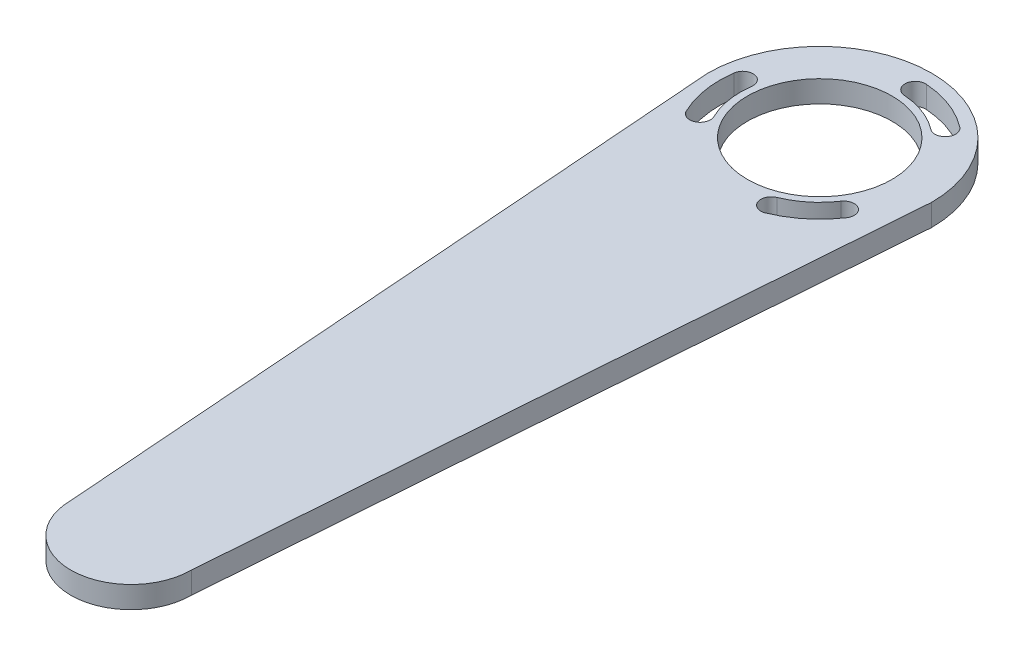
ISO-10303-21;
HEADER;
FILE_DESCRIPTION(('STEP AP214'),'2;1');
FILE_NAME('part.step','',(''),(''),'','','');
FILE_SCHEMA(('AUTOMOTIVE_DESIGN { 1 0 10303 214 1 1 1 1 }'));
ENDSEC;
DATA;
#1=APPLICATION_CONTEXT('core data for automotive mechanical design processes');
#2=APPLICATION_PROTOCOL_DEFINITION('international standard','automotive_design',2000,#1);
#3=PRODUCT_CONTEXT('',#1,'mechanical');
#4=PRODUCT('Part','Part','',(#3));
#5=PRODUCT_RELATED_PRODUCT_CATEGORY('part','',(#4));
#6=PRODUCT_DEFINITION_FORMATION('','',#4);
#7=PRODUCT_DEFINITION_CONTEXT('part definition',#1,'design');
#8=PRODUCT_DEFINITION('design','',#6,#7);
#9=PRODUCT_DEFINITION_SHAPE('','',#8);
#10=(LENGTH_UNIT() NAMED_UNIT(*) SI_UNIT(.MILLI.,.METRE.));
#11=(NAMED_UNIT(*) PLANE_ANGLE_UNIT() SI_UNIT($,.RADIAN.));
#12=(NAMED_UNIT(*) SI_UNIT($,.STERADIAN.) SOLID_ANGLE_UNIT());
#13=UNCERTAINTY_MEASURE_WITH_UNIT(LENGTH_MEASURE(1.E-05),#10,'distance_accuracy_value','');
#14=(GEOMETRIC_REPRESENTATION_CONTEXT(3) GLOBAL_UNCERTAINTY_ASSIGNED_CONTEXT((#13)) GLOBAL_UNIT_ASSIGNED_CONTEXT((#10,
#11,#12)) REPRESENTATION_CONTEXT('',''));
#15=CARTESIAN_POINT('',(0.,0.,0.));
#16=DIRECTION('',(0.,0.,1.));
#17=DIRECTION('',(1.,0.,0.));
#18=AXIS2_PLACEMENT_3D('',#15,#16,#17);
#19=CARTESIAN_POINT('',(0.,3.175,0.));
#20=DIRECTION('',(0.,1.,0.));
#21=DIRECTION('',(0.,0.,1.));
#22=AXIS2_PLACEMENT_3D('',#19,#20,#21);
#23=PLANE('',#22);
#24=CARTESIAN_POINT('',(9.92653417651803,3.175,24.030478964066));
#25=DIRECTION('',(0.,-1.,0.));
#26=DIRECTION('',(-0.866025403784444,0.,-0.499999999999991));
#27=AXIS2_PLACEMENT_3D('',#24,#25,#26);
#28=CIRCLE('',#27,3.);
#29=CARTESIAN_POINT('',(11.0719035045778,3.175,26.8032265368429));
#30=VERTEX_POINT('',#29);
#31=CARTESIAN_POINT('',(8.78116484845827,3.175,21.2577313912892));
#32=VERTEX_POINT('',#31);
#33=EDGE_CURVE('E191',#30,#32,#28,.T.);
#34=ORIENTED_EDGE('',*,*,#33,.T.);
#35=CARTESIAN_POINT('',(0.,3.175,0.));
#36=DIRECTION('',(0.,1.,0.));
#37=DIRECTION('',(-0.866025403784444,0.,-0.499999999999991));
#38=AXIS2_PLACEMENT_3D('',#35,#36,#37);
#39=CIRCLE('',#38,23.);
#40=CARTESIAN_POINT('',(19.0625504882996,3.175,12.869311126903));
#41=VERTEX_POINT('',#40);
#42=EDGE_CURVE('E194',#32,#41,#39,.T.);
#43=ORIENTED_EDGE('',*,*,#42,.T.);
#44=CARTESIAN_POINT('',(21.5489701172082,3.175,14.5479169260643));
#45=DIRECTION('',(0.,-1.,0.));
#46=DIRECTION('',(0.866025403784444,0.,0.499999999999991));
#47=AXIS2_PLACEMENT_3D('',#44,#45,#46);
#48=CIRCLE('',#47,3.);
#49=CARTESIAN_POINT('',(24.0353897461169,3.175,16.2265227252255));
#50=VERTEX_POINT('',#49);
#51=EDGE_CURVE('E61',#41,#50,#48,.T.);
#52=ORIENTED_EDGE('',*,*,#51,.T.);
#53=CARTESIAN_POINT('',(0.,3.175,0.));
#54=DIRECTION('',(0.,-1.,0.));
#55=DIRECTION('',(0.866025403784444,0.,0.499999999999991));
#56=AXIS2_PLACEMENT_3D('',#53,#54,#55);
#57=CIRCLE('',#56,29.);
#58=EDGE_CURVE('E199',#50,#30,#57,.T.);
#59=ORIENTED_EDGE('',*,*,#58,.T.);
#60=EDGE_LOOP('',(#34,#43,#52,#59));
#61=FACE_BOUND('',#60,.T.);
#62=DIRECTION('',(0.0747899482416342,0.,-0.997199309888456));
#63=VECTOR('',#62,1.);
#64=CARTESIAN_POINT('',(32.3182100683654,3.175,2.42386575512741));
#65=LINE('',#64,#63);
#66=CARTESIAN_POINT('',(17.5,3.175,200.));
#67=VERTEX_POINT('',#66);
#68=CARTESIAN_POINT('',(32.5,3.175,0.));
#69=VERTEX_POINT('',#68);
#70=EDGE_CURVE('E258',#67,#69,#65,.T.);
#71=ORIENTED_EDGE('',*,*,#70,.T.);
#72=CARTESIAN_POINT('',(0.,3.175,0.));
#73=DIRECTION('',(0.,1.,0.));
#74=DIRECTION('',(0.,0.,1.));
#75=AXIS2_PLACEMENT_3D('',#72,#73,#74);
#76=CIRCLE('',#75,32.5);
#77=CARTESIAN_POINT('',(-32.5,3.175,0.));
#78=VERTEX_POINT('',#77);
#79=EDGE_CURVE('E261',#69,#78,#76,.T.);
#80=ORIENTED_EDGE('',*,*,#79,.T.);
#81=DIRECTION('',(0.0747899482416342,0.,0.997199309888456));
#82=VECTOR('',#81,1.);
#83=CARTESIAN_POINT('',(-32.3182100683654,3.175,2.42386575512741));
#84=LINE('',#83,#82);
#85=CARTESIAN_POINT('',(-17.5,3.175,200.));
#86=VERTEX_POINT('',#85);
#87=EDGE_CURVE('E264',#78,#86,#84,.T.);
#88=ORIENTED_EDGE('',*,*,#87,.T.);
#89=CARTESIAN_POINT('',(0.,3.175,200.));
#90=DIRECTION('',(0.,1.,0.));
#91=DIRECTION('',(0.,0.,1.));
#92=AXIS2_PLACEMENT_3D('',#89,#90,#91);
#93=CIRCLE('',#92,17.5);
#94=EDGE_CURVE('E266',#86,#67,#93,.T.);
#95=ORIENTED_EDGE('',*,*,#94,.T.);
#96=EDGE_LOOP('',(#71,#80,#88,#95));
#97=FACE_BOUND('',#96,.T.);
#98=CARTESIAN_POINT('',(0.,3.175,0.));
#99=DIRECTION('',(0.,1.,0.));
#100=DIRECTION('',(0.,0.,1.));
#101=AXIS2_PLACEMENT_3D('',#98,#99,#100);
#102=CIRCLE('',#101,21.);
#103=CARTESIAN_POINT('',(0.,3.175,21.));
#104=VERTEX_POINT('',#103);
#105=EDGE_CURVE('E245',#104,#104,#102,.T.);
#106=ORIENTED_EDGE('',*,*,#105,.F.);
#107=EDGE_LOOP('',(#106));
#108=FACE_BOUND('',#107,.T.);
#109=CARTESIAN_POINT('',(15.8477381597299,3.175,-20.6118702504319));
#110=DIRECTION('',(0.,-1.,0.));
#111=DIRECTION('',(0.,0.,1.));
#112=AXIS2_PLACEMENT_3D('',#109,#110,#111);
#113=CIRCLE('',#112,3.);
#114=CARTESIAN_POINT('',(17.6763233320065,3.175,-22.9901629716356));
#115=VERTEX_POINT('',#114);
#116=CARTESIAN_POINT('',(14.0191529874534,3.175,-18.2335775292282));
#117=VERTEX_POINT('',#116);
#118=EDGE_CURVE('E220',#115,#117,#113,.T.);
#119=ORIENTED_EDGE('',*,*,#118,.T.);
#120=CARTESIAN_POINT('',(0.,3.175,0.));
#121=DIRECTION('',(0.,1.,0.));
#122=DIRECTION('',(0.,0.,1.));
#123=AXIS2_PLACEMENT_3D('',#120,#121,#122);
#124=CIRCLE('',#123,23.);
#125=CARTESIAN_POINT('',(1.61387512095415,3.175,-22.9433085472424));
#126=VERTEX_POINT('',#125);
#127=EDGE_CURVE('E223',#117,#126,#124,.T.);
#128=ORIENTED_EDGE('',*,*,#127,.T.);
#129=CARTESIAN_POINT('',(1.82438057151341,3.175,-25.9359140099262));
#130=DIRECTION('',(0.,-1.,0.));
#131=DIRECTION('',(0.,0.,-1.));
#132=AXIS2_PLACEMENT_3D('',#129,#130,#131);
#133=CIRCLE('',#132,3.);
#134=CARTESIAN_POINT('',(2.03488602207263,3.175,-28.92851947261));
#135=VERTEX_POINT('',#134);
#136=EDGE_CURVE('E227',#126,#135,#133,.T.);
#137=ORIENTED_EDGE('',*,*,#136,.T.);
#138=CARTESIAN_POINT('',(0.,3.175,0.));
#139=DIRECTION('',(0.,-1.,0.));
#140=DIRECTION('',(0.,0.,-1.));
#141=AXIS2_PLACEMENT_3D('',#138,#139,#140);
#142=CIRCLE('',#141,29.);
#143=EDGE_CURVE('E230',#135,#115,#142,.T.);
#144=ORIENTED_EDGE('',*,*,#143,.T.);
#145=EDGE_LOOP('',(#119,#128,#137,#144));
#146=FACE_BOUND('',#145,.T.);
#147=CARTESIAN_POINT('',(-25.7742723362477,3.175,-3.41860871363409));
#148=DIRECTION('',(0.,-1.,0.));
#149=DIRECTION('',(0.866025403784436,0.,-0.500000000000004));
#150=AXIS2_PLACEMENT_3D('',#147,#148,#149);
#151=CIRCLE('',#150,3.);
#152=CARTESIAN_POINT('',(-28.748226836584,3.175,-3.81306356520725));
#153=VERTEX_POINT('',#152);
#154=CARTESIAN_POINT('',(-22.8003178359115,3.175,-3.02415386206091));
#155=VERTEX_POINT('',#154);
#156=EDGE_CURVE('E155',#153,#155,#151,.T.);
#157=ORIENTED_EDGE('',*,*,#156,.T.);
#158=CARTESIAN_POINT('',(0.,3.175,0.));
#159=DIRECTION('',(0.,1.,0.));
#160=DIRECTION('',(0.866025403784436,0.,-0.500000000000004));
#161=AXIS2_PLACEMENT_3D('',#158,#159,#160);
#162=CIRCLE('',#161,23.);
#163=CARTESIAN_POINT('',(-20.6764256092536,3.175,10.0739974203393));
#164=VERTEX_POINT('',#163);
#165=EDGE_CURVE('E166',#155,#164,#162,.T.);
#166=ORIENTED_EDGE('',*,*,#165,.T.);
#167=CARTESIAN_POINT('',(-23.3733506887214,3.175,11.3879970838618));
#168=DIRECTION('',(0.,-1.,0.));
#169=DIRECTION('',(-0.866025403784436,0.,0.500000000000004));
#170=AXIS2_PLACEMENT_3D('',#167,#168,#169);
#171=CIRCLE('',#170,3.);
#172=CARTESIAN_POINT('',(-26.0702757681893,3.175,12.7019967473843));
#173=VERTEX_POINT('',#172);
#174=EDGE_CURVE('E53',#164,#173,#171,.T.);
#175=ORIENTED_EDGE('',*,*,#174,.T.);
#176=CARTESIAN_POINT('',(0.,3.175,0.));
#177=DIRECTION('',(0.,-1.,0.));
#178=DIRECTION('',(-0.866025403784436,0.,0.500000000000004));
#179=AXIS2_PLACEMENT_3D('',#176,#177,#178);
#180=CIRCLE('',#179,29.);
#181=EDGE_CURVE('E163',#173,#153,#180,.T.);
#182=ORIENTED_EDGE('',*,*,#181,.T.);
#183=EDGE_LOOP('',(#157,#166,#175,#182));
#184=FACE_BOUND('',#183,.T.);
#185=ADVANCED_FACE('F38',(#61,#97,#108,#146,#184),#23,.T.);
#186=CARTESIAN_POINT('',(0.,-3.175,0.));
#187=DIRECTION('',(0.,1.,0.));
#188=DIRECTION('',(0.,0.,1.));
#189=AXIS2_PLACEMENT_3D('',#186,#187,#188);
#190=PLANE('',#189);
#191=CARTESIAN_POINT('',(0.,-3.175,0.));
#192=DIRECTION('',(0.,1.,0.));
#193=DIRECTION('',(0.,0.,1.));
#194=AXIS2_PLACEMENT_3D('',#191,#192,#193);
#195=CIRCLE('',#194,21.);
#196=CARTESIAN_POINT('',(0.,-3.175,21.));
#197=VERTEX_POINT('',#196);
#198=EDGE_CURVE('E252',#197,#197,#195,.T.);
#199=ORIENTED_EDGE('',*,*,#198,.T.);
#200=EDGE_LOOP('',(#199));
#201=FACE_BOUND('',#200,.T.);
#202=DIRECTION('',(0.0747899482416342,0.,-0.997199309888456));
#203=VECTOR('',#202,1.);
#204=CARTESIAN_POINT('',(32.3182100683654,-3.175,2.42386575512741));
#205=LINE('',#204,#203);
#206=CARTESIAN_POINT('',(17.5,-3.175,200.));
#207=VERTEX_POINT('',#206);
#208=CARTESIAN_POINT('',(32.5,-3.175,0.));
#209=VERTEX_POINT('',#208);
#210=EDGE_CURVE('E255',#207,#209,#205,.T.);
#211=ORIENTED_EDGE('',*,*,#210,.F.);
#212=CARTESIAN_POINT('',(0.,-3.175,200.));
#213=DIRECTION('',(0.,1.,0.));
#214=DIRECTION('',(0.,0.,1.));
#215=AXIS2_PLACEMENT_3D('',#212,#213,#214);
#216=CIRCLE('',#215,17.5);
#217=CARTESIAN_POINT('',(-17.5,-3.175,200.));
#218=VERTEX_POINT('',#217);
#219=EDGE_CURVE('E262',#218,#207,#216,.T.);
#220=ORIENTED_EDGE('',*,*,#219,.F.);
#221=DIRECTION('',(0.0747899482416342,0.,0.997199309888456));
#222=VECTOR('',#221,1.);
#223=CARTESIAN_POINT('',(-32.3182100683654,-3.175,2.42386575512741));
#224=LINE('',#223,#222);
#225=CARTESIAN_POINT('',(-32.5,-3.175,0.));
#226=VERTEX_POINT('',#225);
#227=EDGE_CURVE('E273',#226,#218,#224,.T.);
#228=ORIENTED_EDGE('',*,*,#227,.F.);
#229=CARTESIAN_POINT('',(0.,-3.175,0.));
#230=DIRECTION('',(0.,1.,0.));
#231=DIRECTION('',(0.,0.,1.));
#232=AXIS2_PLACEMENT_3D('',#229,#230,#231);
#233=CIRCLE('',#232,32.5);
#234=EDGE_CURVE('E271',#209,#226,#233,.T.);
#235=ORIENTED_EDGE('',*,*,#234,.F.);
#236=EDGE_LOOP('',(#211,#220,#228,#235));
#237=FACE_BOUND('',#236,.T.);
#238=CARTESIAN_POINT('',(0.,-3.175,0.));
#239=DIRECTION('',(0.,1.,0.));
#240=DIRECTION('',(0.,0.,1.));
#241=AXIS2_PLACEMENT_3D('',#238,#239,#240);
#242=CIRCLE('',#241,23.);
#243=CARTESIAN_POINT('',(14.0191529874534,-3.175,-18.2335775292282));
#244=VERTEX_POINT('',#243);
#245=CARTESIAN_POINT('',(1.61387512095415,-3.175,-22.9433085472424));
#246=VERTEX_POINT('',#245);
#247=EDGE_CURVE('E235',#244,#246,#242,.T.);
#248=ORIENTED_EDGE('',*,*,#247,.F.);
#249=CARTESIAN_POINT('',(15.8477381597299,-3.175,-20.6118702504319));
#250=DIRECTION('',(0.,-1.,0.));
#251=DIRECTION('',(0.,0.,1.));
#252=AXIS2_PLACEMENT_3D('',#249,#250,#251);
#253=CIRCLE('',#252,3.);
#254=CARTESIAN_POINT('',(17.6763233320065,-3.175,-22.9901629716356));
#255=VERTEX_POINT('',#254);
#256=EDGE_CURVE('E187',#255,#244,#253,.T.);
#257=ORIENTED_EDGE('',*,*,#256,.F.);
#258=CARTESIAN_POINT('',(0.,-3.175,0.));
#259=DIRECTION('',(0.,-1.,0.));
#260=DIRECTION('',(0.,0.,-1.));
#261=AXIS2_PLACEMENT_3D('',#258,#259,#260);
#262=CIRCLE('',#261,29.);
#263=CARTESIAN_POINT('',(2.03488602207263,-3.175,-28.92851947261));
#264=VERTEX_POINT('',#263);
#265=EDGE_CURVE('E224',#264,#255,#262,.T.);
#266=ORIENTED_EDGE('',*,*,#265,.F.);
#267=CARTESIAN_POINT('',(1.82438057151341,-3.175,-25.9359140099262));
#268=DIRECTION('',(0.,-1.,0.));
#269=DIRECTION('',(0.,0.,-1.));
#270=AXIS2_PLACEMENT_3D('',#267,#268,#269);
#271=CIRCLE('',#270,3.);
#272=EDGE_CURVE('E238',#246,#264,#271,.T.);
#273=ORIENTED_EDGE('',*,*,#272,.F.);
#274=EDGE_LOOP('',(#248,#257,#266,#273));
#275=FACE_BOUND('',#274,.T.);
#276=CARTESIAN_POINT('',(0.,-3.175,0.));
#277=DIRECTION('',(0.,1.,0.));
#278=DIRECTION('',(-0.866025403784444,0.,-0.499999999999991));
#279=AXIS2_PLACEMENT_3D('',#276,#277,#278);
#280=CIRCLE('',#279,23.);
#281=CARTESIAN_POINT('',(8.78116484845827,-3.175,21.2577313912892));
#282=VERTEX_POINT('',#281);
#283=CARTESIAN_POINT('',(19.0625504882996,-3.175,12.869311126903));
#284=VERTEX_POINT('',#283);
#285=EDGE_CURVE('E205',#282,#284,#280,.T.);
#286=ORIENTED_EDGE('',*,*,#285,.F.);
#287=CARTESIAN_POINT('',(9.92653417651803,-3.175,24.030478964066));
#288=DIRECTION('',(0.,-1.,0.));
#289=DIRECTION('',(-0.866025403784444,0.,-0.499999999999991));
#290=AXIS2_PLACEMENT_3D('',#287,#288,#289);
#291=CIRCLE('',#290,3.);
#292=CARTESIAN_POINT('',(11.0719035045778,-3.175,26.8032265368429));
#293=VERTEX_POINT('',#292);
#294=EDGE_CURVE('E203',#293,#282,#291,.T.);
#295=ORIENTED_EDGE('',*,*,#294,.F.);
#296=CARTESIAN_POINT('',(0.,-3.175,0.));
#297=DIRECTION('',(0.,-1.,0.));
#298=DIRECTION('',(0.866025403784444,0.,0.499999999999991));
#299=AXIS2_PLACEMENT_3D('',#296,#297,#298);
#300=CIRCLE('',#299,29.);
#301=CARTESIAN_POINT('',(24.0353897461169,-3.175,16.2265227252255));
#302=VERTEX_POINT('',#301);
#303=EDGE_CURVE('E195',#302,#293,#300,.T.);
#304=ORIENTED_EDGE('',*,*,#303,.F.);
#305=CARTESIAN_POINT('',(21.5489701172082,-3.175,14.5479169260643));
#306=DIRECTION('',(0.,-1.,0.));
#307=DIRECTION('',(0.866025403784444,0.,0.499999999999991));
#308=AXIS2_PLACEMENT_3D('',#305,#306,#307);
#309=CIRCLE('',#308,3.);
#310=EDGE_CURVE('E208',#284,#302,#309,.T.);
#311=ORIENTED_EDGE('',*,*,#310,.F.);
#312=EDGE_LOOP('',(#286,#295,#304,#311));
#313=FACE_BOUND('',#312,.T.);
#314=CARTESIAN_POINT('',(0.,-3.175,0.));
#315=DIRECTION('',(0.,1.,0.));
#316=DIRECTION('',(0.866025403784436,0.,-0.500000000000004));
#317=AXIS2_PLACEMENT_3D('',#314,#315,#316);
#318=CIRCLE('',#317,23.);
#319=CARTESIAN_POINT('',(-22.8003178359115,-3.175,-3.02415386206091));
#320=VERTEX_POINT('',#319);
#321=CARTESIAN_POINT('',(-20.6764256092536,-3.175,10.0739974203393));
#322=VERTEX_POINT('',#321);
#323=EDGE_CURVE('E180',#320,#322,#318,.T.);
#324=ORIENTED_EDGE('',*,*,#323,.F.);
#325=CARTESIAN_POINT('',(-25.7742723362477,-3.175,-3.41860871363409));
#326=DIRECTION('',(0.,-1.,0.));
#327=DIRECTION('',(0.866025403784436,0.,-0.500000000000004));
#328=AXIS2_PLACEMENT_3D('',#325,#326,#327);
#329=CIRCLE('',#328,3.);
#330=CARTESIAN_POINT('',(-28.748226836584,-3.175,-3.81306356520725));
#331=VERTEX_POINT('',#330);
#332=EDGE_CURVE('E158',#331,#320,#329,.T.);
#333=ORIENTED_EDGE('',*,*,#332,.F.);
#334=CARTESIAN_POINT('',(0.,-3.175,0.));
#335=DIRECTION('',(0.,-1.,0.));
#336=DIRECTION('',(-0.866025403784436,0.,0.500000000000004));
#337=AXIS2_PLACEMENT_3D('',#334,#335,#336);
#338=CIRCLE('',#337,29.);
#339=CARTESIAN_POINT('',(-26.0702757681893,-3.175,12.7019967473843));
#340=VERTEX_POINT('',#339);
#341=EDGE_CURVE('E171',#340,#331,#338,.T.);
#342=ORIENTED_EDGE('',*,*,#341,.F.);
#343=CARTESIAN_POINT('',(-23.3733506887214,-3.175,11.3879970838618));
#344=DIRECTION('',(0.,-1.,0.));
#345=DIRECTION('',(-0.866025403784436,0.,0.500000000000004));
#346=AXIS2_PLACEMENT_3D('',#343,#344,#345);
#347=CIRCLE('',#346,3.);
#348=EDGE_CURVE('E174',#322,#340,#347,.T.);
#349=ORIENTED_EDGE('',*,*,#348,.F.);
#350=EDGE_LOOP('',(#324,#333,#342,#349));
#351=FACE_BOUND('',#350,.T.);
#352=ADVANCED_FACE('F291',(#201,#237,#275,#313,#351),#190,.F.);
#353=CARTESIAN_POINT('',(32.3182100683654,3.175,2.42386575512741));
#354=DIRECTION('',(-0.997199309888456,0.,-0.0747899482416342));
#355=DIRECTION('',(-0.0747899482416342,0.,0.997199309888457));
#356=AXIS2_PLACEMENT_3D('',#353,#354,#355);
#357=PLANE('',#356);
#358=ORIENTED_EDGE('',*,*,#210,.T.);
#359=DIRECTION('',(0.,-1.,0.));
#360=VECTOR('',#359,1.);
#361=CARTESIAN_POINT('',(32.5,3.175,0.));
#362=LINE('',#361,#360);
#363=EDGE_CURVE('E11',#69,#209,#362,.T.);
#364=ORIENTED_EDGE('',*,*,#363,.F.);
#365=ORIENTED_EDGE('',*,*,#70,.F.);
#366=DIRECTION('',(0.,-1.,0.));
#367=VECTOR('',#366,1.);
#368=CARTESIAN_POINT('',(17.5,3.175,200.));
#369=LINE('',#368,#367);
#370=EDGE_CURVE('E268',#67,#207,#369,.T.);
#371=ORIENTED_EDGE('',*,*,#370,.T.);
#372=EDGE_LOOP('',(#358,#364,#365,#371));
#373=FACE_BOUND('',#372,.T.);
#374=ADVANCED_FACE('F40',(#373),#357,.F.);
#375=CARTESIAN_POINT('',(0.,3.175,0.));
#376=DIRECTION('',(0.,-1.,0.));
#377=DIRECTION('',(0.,0.,-1.));
#378=AXIS2_PLACEMENT_3D('',#375,#376,#377);
#379=CYLINDRICAL_SURFACE('',#378,32.5);
#380=ORIENTED_EDGE('',*,*,#234,.T.);
#381=DIRECTION('',(0.,-1.,0.));
#382=VECTOR('',#381,1.);
#383=CARTESIAN_POINT('',(-32.5,3.175,0.));
#384=LINE('',#383,#382);
#385=EDGE_CURVE('E46',#78,#226,#384,.T.);
#386=ORIENTED_EDGE('',*,*,#385,.F.);
#387=ORIENTED_EDGE('',*,*,#79,.F.);
#388=ORIENTED_EDGE('',*,*,#363,.T.);
#389=EDGE_LOOP('',(#380,#386,#387,#388));
#390=FACE_BOUND('',#389,.T.);
#391=ADVANCED_FACE('F302',(#390),#379,.T.);
#392=CARTESIAN_POINT('',(-32.3182100683654,3.175,2.42386575512741));
#393=DIRECTION('',(0.997199309888456,0.,-0.0747899482416342));
#394=DIRECTION('',(-0.0747899482416342,0.,-0.997199309888457));
#395=AXIS2_PLACEMENT_3D('',#392,#393,#394);
#396=PLANE('',#395);
#397=ORIENTED_EDGE('',*,*,#227,.T.);
#398=DIRECTION('',(0.,-1.,0.));
#399=VECTOR('',#398,1.);
#400=CARTESIAN_POINT('',(-17.5,3.175,200.));
#401=LINE('',#400,#399);
#402=EDGE_CURVE('E278',#86,#218,#401,.T.);
#403=ORIENTED_EDGE('',*,*,#402,.F.);
#404=ORIENTED_EDGE('',*,*,#87,.F.);
#405=ORIENTED_EDGE('',*,*,#385,.T.);
#406=EDGE_LOOP('',(#397,#403,#404,#405));
#407=FACE_BOUND('',#406,.T.);
#408=ADVANCED_FACE('F285',(#407),#396,.F.);
#409=CARTESIAN_POINT('',(0.,3.175,200.));
#410=DIRECTION('',(0.,-1.,0.));
#411=DIRECTION('',(0.,0.,-1.));
#412=AXIS2_PLACEMENT_3D('',#409,#410,#411);
#413=CYLINDRICAL_SURFACE('',#412,17.5);
#414=ORIENTED_EDGE('',*,*,#219,.T.);
#415=ORIENTED_EDGE('',*,*,#370,.F.);
#416=ORIENTED_EDGE('',*,*,#94,.F.);
#417=ORIENTED_EDGE('',*,*,#402,.T.);
#418=EDGE_LOOP('',(#414,#415,#416,#417));
#419=FACE_BOUND('',#418,.T.);
#420=ADVANCED_FACE('F295',(#419),#413,.T.);
#421=CARTESIAN_POINT('',(0.,-3.175,0.));
#422=DIRECTION('',(0.,1.,0.));
#423=DIRECTION('',(0.,0.,1.));
#424=AXIS2_PLACEMENT_3D('',#421,#422,#423);
#425=CYLINDRICAL_SURFACE('',#424,21.);
#426=ORIENTED_EDGE('',*,*,#198,.F.);
#427=EDGE_LOOP('',(#426));
#428=FACE_BOUND('',#427,.T.);
#429=ORIENTED_EDGE('',*,*,#105,.T.);
#430=EDGE_LOOP('',(#429));
#431=FACE_BOUND('',#430,.T.);
#432=ADVANCED_FACE('F318',(#428,#431),#425,.F.);
#433=CARTESIAN_POINT('',(15.8477381597299,3.175,-20.6118702504319));
#434=DIRECTION('',(0.,-1.,0.));
#435=DIRECTION('',(0.,0.,-1.));
#436=AXIS2_PLACEMENT_3D('',#433,#434,#435);
#437=CYLINDRICAL_SURFACE('',#436,3.);
#438=ORIENTED_EDGE('',*,*,#256,.T.);
#439=DIRECTION('',(0.,-1.,0.));
#440=VECTOR('',#439,1.);
#441=CARTESIAN_POINT('',(14.0191529874534,3.175,-18.2335775292282));
#442=LINE('',#441,#440);
#443=EDGE_CURVE('E233',#117,#244,#442,.T.);
#444=ORIENTED_EDGE('',*,*,#443,.F.);
#445=ORIENTED_EDGE('',*,*,#118,.F.);
#446=DIRECTION('',(0.,-1.,0.));
#447=VECTOR('',#446,1.);
#448=CARTESIAN_POINT('',(17.6763233320065,3.175,-22.9901629716356));
#449=LINE('',#448,#447);
#450=EDGE_CURVE('E243',#115,#255,#449,.T.);
#451=ORIENTED_EDGE('',*,*,#450,.T.);
#452=EDGE_LOOP('',(#438,#444,#445,#451));
#453=FACE_BOUND('',#452,.T.);
#454=ADVANCED_FACE('F325',(#453),#437,.F.);
#455=CARTESIAN_POINT('',(0.,3.175,0.));
#456=DIRECTION('',(0.,-1.,0.));
#457=DIRECTION('',(0.,0.,-1.));
#458=AXIS2_PLACEMENT_3D('',#455,#456,#457);
#459=CYLINDRICAL_SURFACE('',#458,29.);
#460=ORIENTED_EDGE('',*,*,#265,.T.);
#461=ORIENTED_EDGE('',*,*,#450,.F.);
#462=ORIENTED_EDGE('',*,*,#143,.F.);
#463=DIRECTION('',(0.,-1.,0.));
#464=VECTOR('',#463,1.);
#465=CARTESIAN_POINT('',(2.03488602207263,3.175,-28.92851947261));
#466=LINE('',#465,#464);
#467=EDGE_CURVE('E246',#135,#264,#466,.T.);
#468=ORIENTED_EDGE('',*,*,#467,.T.);
#469=EDGE_LOOP('',(#460,#461,#462,#468));
#470=FACE_BOUND('',#469,.T.);
#471=ADVANCED_FACE('F330',(#470),#459,.F.);
#472=CARTESIAN_POINT('',(1.82438057151341,3.175,-25.9359140099262));
#473=DIRECTION('',(0.,-1.,0.));
#474=DIRECTION('',(0.,0.,-1.));
#475=AXIS2_PLACEMENT_3D('',#472,#473,#474);
#476=CYLINDRICAL_SURFACE('',#475,3.);
#477=ORIENTED_EDGE('',*,*,#272,.T.);
#478=ORIENTED_EDGE('',*,*,#467,.F.);
#479=ORIENTED_EDGE('',*,*,#136,.F.);
#480=DIRECTION('',(0.,-1.,0.));
#481=VECTOR('',#480,1.);
#482=CARTESIAN_POINT('',(1.61387512095415,3.175,-22.9433085472424));
#483=LINE('',#482,#481);
#484=EDGE_CURVE('E248',#126,#246,#483,.T.);
#485=ORIENTED_EDGE('',*,*,#484,.T.);
#486=EDGE_LOOP('',(#477,#478,#479,#485));
#487=FACE_BOUND('',#486,.T.);
#488=ADVANCED_FACE('F346',(#487),#476,.F.);
#489=CARTESIAN_POINT('',(0.,3.175,0.));
#490=DIRECTION('',(0.,-1.,0.));
#491=DIRECTION('',(0.,0.,-1.));
#492=AXIS2_PLACEMENT_3D('',#489,#490,#491);
#493=CYLINDRICAL_SURFACE('',#492,23.);
#494=ORIENTED_EDGE('',*,*,#247,.T.);
#495=ORIENTED_EDGE('',*,*,#484,.F.);
#496=ORIENTED_EDGE('',*,*,#127,.F.);
#497=ORIENTED_EDGE('',*,*,#443,.T.);
#498=EDGE_LOOP('',(#494,#495,#496,#497));
#499=FACE_BOUND('',#498,.T.);
#500=ADVANCED_FACE('F343',(#499),#493,.T.);
#501=CARTESIAN_POINT('',(9.92653417651803,3.175,24.030478964066));
#502=DIRECTION('',(0.,-1.,0.));
#503=DIRECTION('',(0.,0.,-1.));
#504=AXIS2_PLACEMENT_3D('',#501,#502,#503);
#505=CYLINDRICAL_SURFACE('',#504,3.);
#506=ORIENTED_EDGE('',*,*,#294,.T.);
#507=DIRECTION('',(0.,-1.,0.));
#508=VECTOR('',#507,1.);
#509=CARTESIAN_POINT('',(8.78116484845827,3.175,21.2577313912892));
#510=LINE('',#509,#508);
#511=EDGE_CURVE('E202',#32,#282,#510,.T.);
#512=ORIENTED_EDGE('',*,*,#511,.F.);
#513=ORIENTED_EDGE('',*,*,#33,.F.);
#514=DIRECTION('',(0.,-1.,0.));
#515=VECTOR('',#514,1.);
#516=CARTESIAN_POINT('',(11.0719035045778,3.175,26.8032265368429));
#517=LINE('',#516,#515);
#518=EDGE_CURVE('E181',#30,#293,#517,.T.);
#519=ORIENTED_EDGE('',*,*,#518,.T.);
#520=EDGE_LOOP('',(#506,#512,#513,#519));
#521=FACE_BOUND('',#520,.T.);
#522=ADVANCED_FACE('F375',(#521),#505,.F.);
#523=CARTESIAN_POINT('',(0.,3.175,0.));
#524=DIRECTION('',(0.,-1.,0.));
#525=DIRECTION('',(0.,0.,-1.));
#526=AXIS2_PLACEMENT_3D('',#523,#524,#525);
#527=CYLINDRICAL_SURFACE('',#526,29.);
#528=ORIENTED_EDGE('',*,*,#303,.T.);
#529=ORIENTED_EDGE('',*,*,#518,.F.);
#530=ORIENTED_EDGE('',*,*,#58,.F.);
#531=DIRECTION('',(0.,-1.,0.));
#532=VECTOR('',#531,1.);
#533=CARTESIAN_POINT('',(24.0353897461169,3.175,16.2265227252255));
#534=LINE('',#533,#532);
#535=EDGE_CURVE('E214',#50,#302,#534,.T.);
#536=ORIENTED_EDGE('',*,*,#535,.T.);
#537=EDGE_LOOP('',(#528,#529,#530,#536));
#538=FACE_BOUND('',#537,.T.);
#539=ADVANCED_FACE('F371',(#538),#527,.F.);
#540=CARTESIAN_POINT('',(21.5489701172082,3.175,14.5479169260643));
#541=DIRECTION('',(0.,-1.,0.));
#542=DIRECTION('',(0.,0.,-1.));
#543=AXIS2_PLACEMENT_3D('',#540,#541,#542);
#544=CYLINDRICAL_SURFACE('',#543,3.);
#545=ORIENTED_EDGE('',*,*,#310,.T.);
#546=ORIENTED_EDGE('',*,*,#535,.F.);
#547=ORIENTED_EDGE('',*,*,#51,.F.);
#548=DIRECTION('',(0.,-1.,0.));
#549=VECTOR('',#548,1.);
#550=CARTESIAN_POINT('',(19.0625504882996,3.175,12.869311126903));
#551=LINE('',#550,#549);
#552=EDGE_CURVE('E216',#41,#284,#551,.T.);
#553=ORIENTED_EDGE('',*,*,#552,.T.);
#554=EDGE_LOOP('',(#545,#546,#547,#553));
#555=FACE_BOUND('',#554,.T.);
#556=ADVANCED_FACE('F374',(#555),#544,.F.);
#557=CARTESIAN_POINT('',(0.,3.175,0.));
#558=DIRECTION('',(0.,-1.,0.));
#559=DIRECTION('',(0.,0.,-1.));
#560=AXIS2_PLACEMENT_3D('',#557,#558,#559);
#561=CYLINDRICAL_SURFACE('',#560,23.);
#562=ORIENTED_EDGE('',*,*,#285,.T.);
#563=ORIENTED_EDGE('',*,*,#552,.F.);
#564=ORIENTED_EDGE('',*,*,#42,.F.);
#565=ORIENTED_EDGE('',*,*,#511,.T.);
#566=EDGE_LOOP('',(#562,#563,#564,#565));
#567=FACE_BOUND('',#566,.T.);
#568=ADVANCED_FACE('F366',(#567),#561,.T.);
#569=CARTESIAN_POINT('',(-25.7742723362477,3.175,-3.41860871363409));
#570=DIRECTION('',(0.,-1.,0.));
#571=DIRECTION('',(0.,0.,-1.));
#572=AXIS2_PLACEMENT_3D('',#569,#570,#571);
#573=CYLINDRICAL_SURFACE('',#572,3.);
#574=ORIENTED_EDGE('',*,*,#332,.T.);
#575=DIRECTION('',(0.,-1.,0.));
#576=VECTOR('',#575,1.);
#577=CARTESIAN_POINT('',(-22.8003178359115,3.175,-3.02415386206091));
#578=LINE('',#577,#576);
#579=EDGE_CURVE('E151',#155,#320,#578,.T.);
#580=ORIENTED_EDGE('',*,*,#579,.F.);
#581=ORIENTED_EDGE('',*,*,#156,.F.);
#582=DIRECTION('',(0.,-1.,0.));
#583=VECTOR('',#582,1.);
#584=CARTESIAN_POINT('',(-28.748226836584,3.175,-3.81306356520725));
#585=LINE('',#584,#583);
#586=EDGE_CURVE('E185',#153,#331,#585,.T.);
#587=ORIENTED_EDGE('',*,*,#586,.T.);
#588=EDGE_LOOP('',(#574,#580,#581,#587));
#589=FACE_BOUND('',#588,.T.);
#590=ADVANCED_FACE('F153',(#589),#573,.F.);
#591=CARTESIAN_POINT('',(0.,3.175,0.));
#592=DIRECTION('',(0.,-1.,0.));
#593=DIRECTION('',(0.,0.,-1.));
#594=AXIS2_PLACEMENT_3D('',#591,#592,#593);
#595=CYLINDRICAL_SURFACE('',#594,29.);
#596=ORIENTED_EDGE('',*,*,#341,.T.);
#597=ORIENTED_EDGE('',*,*,#586,.F.);
#598=ORIENTED_EDGE('',*,*,#181,.F.);
#599=DIRECTION('',(0.,-1.,0.));
#600=VECTOR('',#599,1.);
#601=CARTESIAN_POINT('',(-26.0702757681893,3.175,12.7019967473843));
#602=LINE('',#601,#600);
#603=EDGE_CURVE('E188',#173,#340,#602,.T.);
#604=ORIENTED_EDGE('',*,*,#603,.T.);
#605=EDGE_LOOP('',(#596,#597,#598,#604));
#606=FACE_BOUND('',#605,.T.);
#607=ADVANCED_FACE('F358',(#606),#595,.F.);
#608=CARTESIAN_POINT('',(-23.3733506887214,3.175,11.3879970838618));
#609=DIRECTION('',(0.,-1.,0.));
#610=DIRECTION('',(0.,0.,-1.));
#611=AXIS2_PLACEMENT_3D('',#608,#609,#610);
#612=CYLINDRICAL_SURFACE('',#611,3.);
#613=ORIENTED_EDGE('',*,*,#348,.T.);
#614=ORIENTED_EDGE('',*,*,#603,.F.);
#615=ORIENTED_EDGE('',*,*,#174,.F.);
#616=DIRECTION('',(0.,-1.,0.));
#617=VECTOR('',#616,1.);
#618=CARTESIAN_POINT('',(-20.6764256092536,3.175,10.0739974203393));
#619=LINE('',#618,#617);
#620=EDGE_CURVE('E162',#164,#322,#619,.T.);
#621=ORIENTED_EDGE('',*,*,#620,.T.);
#622=EDGE_LOOP('',(#613,#614,#615,#621));
#623=FACE_BOUND('',#622,.T.);
#624=ADVANCED_FACE('F356',(#623),#612,.F.);
#625=CARTESIAN_POINT('',(0.,3.175,0.));
#626=DIRECTION('',(0.,-1.,0.));
#627=DIRECTION('',(0.,0.,-1.));
#628=AXIS2_PLACEMENT_3D('',#625,#626,#627);
#629=CYLINDRICAL_SURFACE('',#628,23.);
#630=ORIENTED_EDGE('',*,*,#323,.T.);
#631=ORIENTED_EDGE('',*,*,#620,.F.);
#632=ORIENTED_EDGE('',*,*,#165,.F.);
#633=ORIENTED_EDGE('',*,*,#579,.T.);
#634=EDGE_LOOP('',(#630,#631,#632,#633));
#635=FACE_BOUND('',#634,.T.);
#636=ADVANCED_FACE('F167',(#635),#629,.T.);
#637=CLOSED_SHELL('',(#185,#352,#374,#391,#408,#420,#432,#454,#471,#488,#500,#522,#539,#556,
#568,#590,#607,#624,#636));
#638=MANIFOLD_SOLID_BREP('B2',#637);
#639=ADVANCED_BREP_SHAPE_REPRESENTATION('',(#18,#638),#14);
#640=SHAPE_DEFINITION_REPRESENTATION(#9,#639);
ENDSEC;
END-ISO-10303-21;
